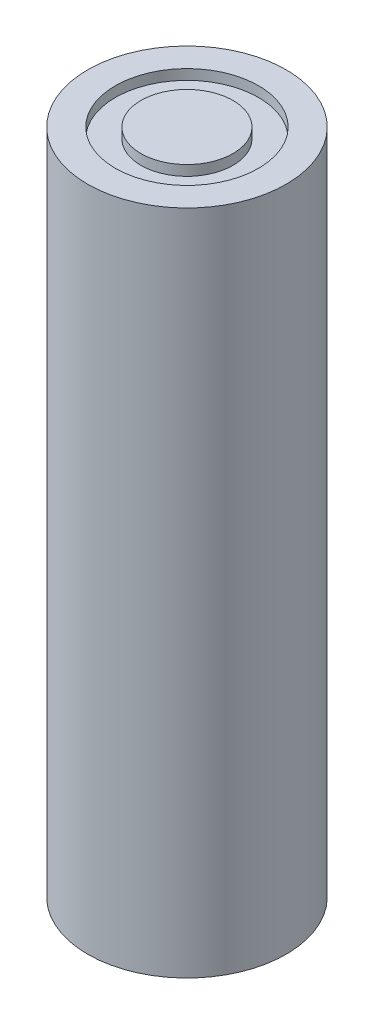
ISO-10303-21;
HEADER;
FILE_DESCRIPTION(('STEP AP214'),'2;1');
FILE_NAME('part.step','',(''),(''),'','','');
FILE_SCHEMA(('AUTOMOTIVE_DESIGN { 1 0 10303 214 1 1 1 1 }'));
ENDSEC;
DATA;
#1=APPLICATION_CONTEXT('core data for automotive mechanical design processes');
#2=APPLICATION_PROTOCOL_DEFINITION('international standard','automotive_design',2000,#1);
#3=PRODUCT_CONTEXT('',#1,'mechanical');
#4=PRODUCT('Part','Part','',(#3));
#5=PRODUCT_RELATED_PRODUCT_CATEGORY('part','',(#4));
#6=PRODUCT_DEFINITION_FORMATION('','',#4);
#7=PRODUCT_DEFINITION_CONTEXT('part definition',#1,'design');
#8=PRODUCT_DEFINITION('design','',#6,#7);
#9=PRODUCT_DEFINITION_SHAPE('','',#8);
#10=(LENGTH_UNIT() NAMED_UNIT(*) SI_UNIT(.MILLI.,.METRE.));
#11=(NAMED_UNIT(*) PLANE_ANGLE_UNIT() SI_UNIT($,.RADIAN.));
#12=(NAMED_UNIT(*) SI_UNIT($,.STERADIAN.) SOLID_ANGLE_UNIT());
#13=UNCERTAINTY_MEASURE_WITH_UNIT(LENGTH_MEASURE(1.E-05),#10,'distance_accuracy_value','');
#14=(GEOMETRIC_REPRESENTATION_CONTEXT(3) GLOBAL_UNCERTAINTY_ASSIGNED_CONTEXT((#13)) GLOBAL_UNIT_ASSIGNED_CONTEXT((#10,
#11,#12)) REPRESENTATION_CONTEXT('',''));
#15=CARTESIAN_POINT('',(0.,0.,0.));
#16=DIRECTION('',(0.,0.,1.));
#17=DIRECTION('',(1.,0.,0.));
#18=AXIS2_PLACEMENT_3D('',#15,#16,#17);
#19=CARTESIAN_POINT('',(0.,65.2,0.));
#20=DIRECTION('',(0.,-1.,0.));
#21=DIRECTION('',(0.,0.,-1.));
#22=AXIS2_PLACEMENT_3D('',#19,#20,#21);
#23=CYLINDRICAL_SURFACE('',#22,9.7);
#24=CARTESIAN_POINT('',(0.,65.2,0.));
#25=DIRECTION('',(0.,1.,0.));
#26=DIRECTION('',(0.,0.,1.));
#27=AXIS2_PLACEMENT_3D('',#24,#25,#26);
#28=CIRCLE('',#27,9.7);
#29=CARTESIAN_POINT('',(0.,65.2,9.7));
#30=VERTEX_POINT('',#29);
#31=EDGE_CURVE('E10',#30,#30,#28,.T.);
#32=ORIENTED_EDGE('',*,*,#31,.F.);
#33=EDGE_LOOP('',(#32));
#34=FACE_BOUND('',#33,.T.);
#35=CARTESIAN_POINT('',(0.,0.,0.));
#36=DIRECTION('',(0.,1.,0.));
#37=DIRECTION('',(0.,0.,1.));
#38=AXIS2_PLACEMENT_3D('',#35,#36,#37);
#39=CIRCLE('',#38,9.7);
#40=CARTESIAN_POINT('',(0.,0.,9.7));
#41=VERTEX_POINT('',#40);
#42=EDGE_CURVE('E35',#41,#41,#39,.T.);
#43=ORIENTED_EDGE('',*,*,#42,.T.);
#44=EDGE_LOOP('',(#43));
#45=FACE_BOUND('',#44,.T.);
#46=ADVANCED_FACE('F32',(#34,#45),#23,.T.);
#47=CARTESIAN_POINT('',(0.,65.2,0.));
#48=DIRECTION('',(0.,1.,0.));
#49=DIRECTION('',(0.,0.,1.));
#50=AXIS2_PLACEMENT_3D('',#47,#48,#49);
#51=PLANE('',#50);
#52=CARTESIAN_POINT('',(0.,65.2,0.));
#53=DIRECTION('',(0.,1.,0.));
#54=DIRECTION('',(0.,0.,1.));
#55=AXIS2_PLACEMENT_3D('',#52,#53,#54);
#56=CIRCLE('',#55,7.);
#57=CARTESIAN_POINT('',(0.,65.2,7.));
#58=VERTEX_POINT('',#57);
#59=EDGE_CURVE('E44',#58,#58,#56,.T.);
#60=ORIENTED_EDGE('',*,*,#59,.F.);
#61=EDGE_LOOP('',(#60));
#62=FACE_BOUND('',#61,.T.);
#63=ORIENTED_EDGE('',*,*,#31,.T.);
#64=EDGE_LOOP('',(#63));
#65=FACE_BOUND('',#64,.T.);
#66=ADVANCED_FACE('F72',(#62,#65),#51,.T.);
#67=CARTESIAN_POINT('',(0.,0.,0.));
#68=DIRECTION('',(0.,1.,0.));
#69=DIRECTION('',(0.,0.,1.));
#70=AXIS2_PLACEMENT_3D('',#67,#68,#69);
#71=PLANE('',#70);
#72=ORIENTED_EDGE('',*,*,#42,.F.);
#73=EDGE_LOOP('',(#72));
#74=FACE_BOUND('',#73,.T.);
#75=ADVANCED_FACE('F68',(#74),#71,.F.);
#76=CARTESIAN_POINT('',(0.,64.2,0.));
#77=DIRECTION('',(0.,1.,0.));
#78=DIRECTION('',(0.,0.,1.));
#79=AXIS2_PLACEMENT_3D('',#76,#77,#78);
#80=CYLINDRICAL_SURFACE('',#79,7.);
#81=CARTESIAN_POINT('',(0.,64.2,0.));
#82=DIRECTION('',(0.,1.,0.));
#83=DIRECTION('',(0.,0.,1.));
#84=AXIS2_PLACEMENT_3D('',#81,#82,#83);
#85=CIRCLE('',#84,7.);
#86=CARTESIAN_POINT('',(0.,64.2,7.));
#87=VERTEX_POINT('',#86);
#88=EDGE_CURVE('E42',#87,#87,#85,.T.);
#89=ORIENTED_EDGE('',*,*,#88,.F.);
#90=EDGE_LOOP('',(#89));
#91=FACE_BOUND('',#90,.T.);
#92=ORIENTED_EDGE('',*,*,#59,.T.);
#93=EDGE_LOOP('',(#92));
#94=FACE_BOUND('',#93,.T.);
#95=ADVANCED_FACE('F62',(#91,#94),#80,.F.);
#96=CARTESIAN_POINT('',(0.,64.2,0.));
#97=DIRECTION('',(0.,1.,0.));
#98=DIRECTION('',(0.,0.,1.));
#99=AXIS2_PLACEMENT_3D('',#96,#97,#98);
#100=PLANE('',#99);
#101=CARTESIAN_POINT('',(0.,64.2,0.));
#102=DIRECTION('',(0.,1.,0.));
#103=DIRECTION('',(0.,0.,1.));
#104=AXIS2_PLACEMENT_3D('',#101,#102,#103);
#105=CIRCLE('',#104,4.5);
#106=CARTESIAN_POINT('',(0.,64.2,4.5));
#107=VERTEX_POINT('',#106);
#108=EDGE_CURVE('E47',#107,#107,#105,.T.);
#109=ORIENTED_EDGE('',*,*,#108,.F.);
#110=EDGE_LOOP('',(#109));
#111=FACE_BOUND('',#110,.T.);
#112=ORIENTED_EDGE('',*,*,#88,.T.);
#113=EDGE_LOOP('',(#112));
#114=FACE_BOUND('',#113,.T.);
#115=ADVANCED_FACE('F59',(#111,#114),#100,.T.);
#116=CARTESIAN_POINT('',(0.,64.2,0.));
#117=DIRECTION('',(0.,1.,0.));
#118=DIRECTION('',(0.,0.,1.));
#119=AXIS2_PLACEMENT_3D('',#116,#117,#118);
#120=CYLINDRICAL_SURFACE('',#119,4.5);
#121=ORIENTED_EDGE('',*,*,#108,.T.);
#122=EDGE_LOOP('',(#121));
#123=FACE_BOUND('',#122,.T.);
#124=CARTESIAN_POINT('',(0.,65.2,0.));
#125=DIRECTION('',(0.,1.,0.));
#126=DIRECTION('',(0.,0.,1.));
#127=AXIS2_PLACEMENT_3D('',#124,#125,#126);
#128=CIRCLE('',#127,4.5);
#129=CARTESIAN_POINT('',(0.,65.2,4.5));
#130=VERTEX_POINT('',#129);
#131=EDGE_CURVE('E50',#130,#130,#128,.T.);
#132=ORIENTED_EDGE('',*,*,#131,.F.);
#133=EDGE_LOOP('',(#132));
#134=FACE_BOUND('',#133,.T.);
#135=ADVANCED_FACE('F56',(#123,#134),#120,.T.);
#136=ORIENTED_EDGE('',*,*,#131,.T.);
#137=EDGE_LOOP('',(#136));
#138=FACE_BOUND('',#137,.T.);
#139=ADVANCED_FACE('F75',(#138),#51,.T.);
#140=CLOSED_SHELL('',(#46,#66,#75,#95,#115,#135,#139));
#141=MANIFOLD_SOLID_BREP('B2',#140);
#142=ADVANCED_BREP_SHAPE_REPRESENTATION('',(#18,#141),#14);
#143=SHAPE_DEFINITION_REPRESENTATION(#9,#142);
ENDSEC;
END-ISO-10303-21;
